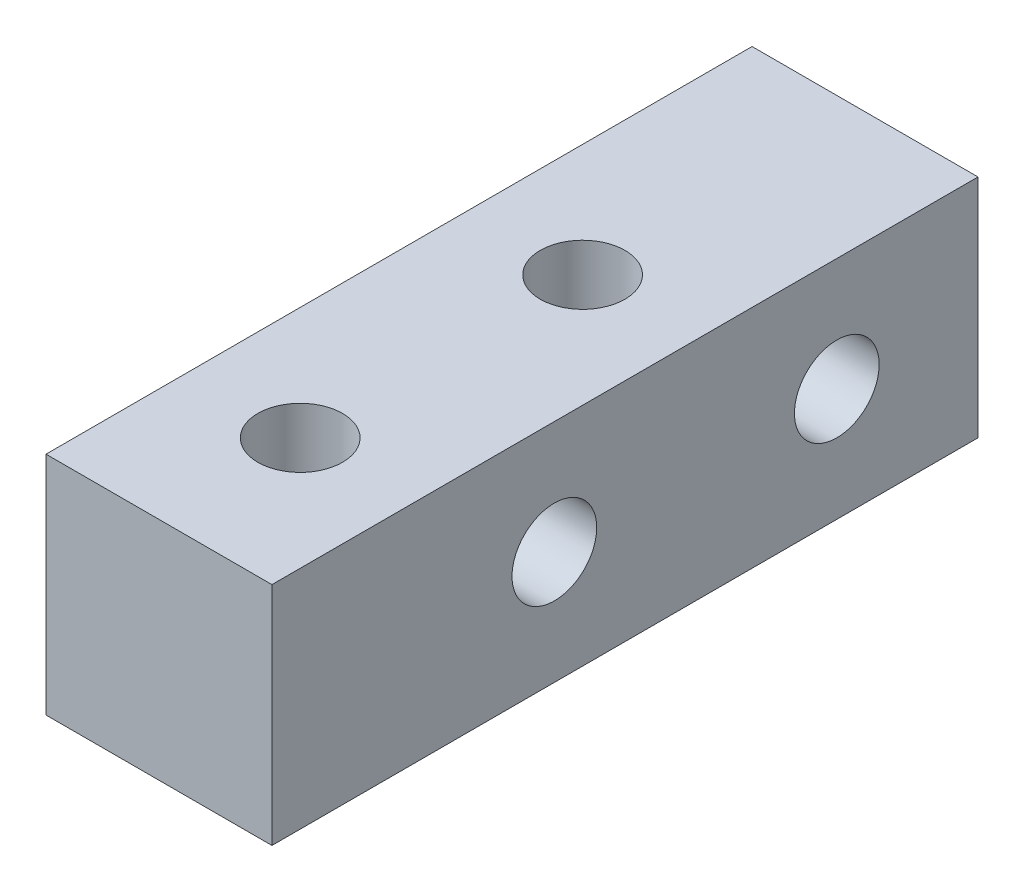
ISO-10303-21;
HEADER;
FILE_DESCRIPTION(('STEP AP214'),'2;1');
FILE_NAME('part.step','',(''),(''),'','','');
FILE_SCHEMA(('AUTOMOTIVE_DESIGN { 1 0 10303 214 1 1 1 1 }'));
ENDSEC;
DATA;
#1=APPLICATION_CONTEXT('core data for automotive mechanical design processes');
#2=APPLICATION_PROTOCOL_DEFINITION('international standard','automotive_design',2000,#1);
#3=PRODUCT_CONTEXT('',#1,'mechanical');
#4=PRODUCT('Part','Part','',(#3));
#5=PRODUCT_RELATED_PRODUCT_CATEGORY('part','',(#4));
#6=PRODUCT_DEFINITION_FORMATION('','',#4);
#7=PRODUCT_DEFINITION_CONTEXT('part definition',#1,'design');
#8=PRODUCT_DEFINITION('design','',#6,#7);
#9=PRODUCT_DEFINITION_SHAPE('','',#8);
#10=(LENGTH_UNIT() NAMED_UNIT(*) SI_UNIT(.MILLI.,.METRE.));
#11=(NAMED_UNIT(*) PLANE_ANGLE_UNIT() SI_UNIT($,.RADIAN.));
#12=(NAMED_UNIT(*) SI_UNIT($,.STERADIAN.) SOLID_ANGLE_UNIT());
#13=UNCERTAINTY_MEASURE_WITH_UNIT(LENGTH_MEASURE(1.E-05),#10,'distance_accuracy_value','');
#14=(GEOMETRIC_REPRESENTATION_CONTEXT(3) GLOBAL_UNCERTAINTY_ASSIGNED_CONTEXT((#13)) GLOBAL_UNIT_ASSIGNED_CONTEXT((#10,
#11,#12)) REPRESENTATION_CONTEXT('',''));
#15=CARTESIAN_POINT('',(0.,0.,0.));
#16=DIRECTION('',(0.,0.,1.));
#17=DIRECTION('',(1.,0.,0.));
#18=AXIS2_PLACEMENT_3D('',#15,#16,#17);
#19=CARTESIAN_POINT('',(4.,-4.,25.));
#20=DIRECTION('',(-1.,0.,0.));
#21=DIRECTION('',(0.,0.,1.));
#22=AXIS2_PLACEMENT_3D('',#19,#20,#21);
#23=PLANE('',#22);
#24=CARTESIAN_POINT('',(4.,0.,5.));
#25=DIRECTION('',(1.,0.,0.));
#26=DIRECTION('',(0.,0.,-1.));
#27=AXIS2_PLACEMENT_3D('',#24,#25,#26);
#28=CIRCLE('',#27,1.5);
#29=CARTESIAN_POINT('',(4.,0.,3.5));
#30=VERTEX_POINT('',#29);
#31=EDGE_CURVE('E125',#30,#30,#28,.T.);
#32=ORIENTED_EDGE('',*,*,#31,.F.);
#33=EDGE_LOOP('',(#32));
#34=FACE_BOUND('',#33,.T.);
#35=CARTESIAN_POINT('',(4.,0.,15.));
#36=DIRECTION('',(1.,0.,0.));
#37=DIRECTION('',(0.,0.,-1.));
#38=AXIS2_PLACEMENT_3D('',#35,#36,#37);
#39=CIRCLE('',#38,1.5);
#40=CARTESIAN_POINT('',(4.,0.,13.5));
#41=VERTEX_POINT('',#40);
#42=EDGE_CURVE('E121',#41,#41,#39,.T.);
#43=ORIENTED_EDGE('',*,*,#42,.F.);
#44=EDGE_LOOP('',(#43));
#45=FACE_BOUND('',#44,.T.);
#46=DIRECTION('',(0.,1.,0.));
#47=VECTOR('',#46,1.);
#48=CARTESIAN_POINT('',(4.,-4.,0.));
#49=LINE('',#48,#47);
#50=CARTESIAN_POINT('',(4.,-4.,0.));
#51=VERTEX_POINT('',#50);
#52=CARTESIAN_POINT('',(4.,4.,0.));
#53=VERTEX_POINT('',#52);
#54=EDGE_CURVE('E104',#51,#53,#49,.T.);
#55=ORIENTED_EDGE('',*,*,#54,.T.);
#56=DIRECTION('',(0.,0.,-1.));
#57=VECTOR('',#56,1.);
#58=CARTESIAN_POINT('',(4.,4.,25.));
#59=LINE('',#58,#57);
#60=CARTESIAN_POINT('',(4.,4.,25.));
#61=VERTEX_POINT('',#60);
#62=EDGE_CURVE('E11',#61,#53,#59,.T.);
#63=ORIENTED_EDGE('',*,*,#62,.F.);
#64=DIRECTION('',(0.,1.,0.));
#65=VECTOR('',#64,1.);
#66=CARTESIAN_POINT('',(4.,-4.,25.));
#67=LINE('',#66,#65);
#68=CARTESIAN_POINT('',(4.,-4.,25.));
#69=VERTEX_POINT('',#68);
#70=EDGE_CURVE('E92',#69,#61,#67,.T.);
#71=ORIENTED_EDGE('',*,*,#70,.F.);
#72=DIRECTION('',(0.,0.,-1.));
#73=VECTOR('',#72,1.);
#74=CARTESIAN_POINT('',(4.,-4.,25.));
#75=LINE('',#74,#73);
#76=EDGE_CURVE('E100',#69,#51,#75,.T.);
#77=ORIENTED_EDGE('',*,*,#76,.T.);
#78=EDGE_LOOP('',(#55,#63,#71,#77));
#79=FACE_BOUND('',#78,.T.);
#80=ADVANCED_FACE('F41',(#34,#45,#79),#23,.F.);
#81=CARTESIAN_POINT('',(-4.,4.,25.));
#82=DIRECTION('',(0.,-1.,0.));
#83=DIRECTION('',(0.,0.,-1.));
#84=AXIS2_PLACEMENT_3D('',#81,#82,#83);
#85=PLANE('',#84);
#86=CARTESIAN_POINT('',(0.,4.,10.));
#87=DIRECTION('',(0.,1.,0.));
#88=DIRECTION('',(0.,0.,1.));
#89=AXIS2_PLACEMENT_3D('',#86,#87,#88);
#90=CIRCLE('',#89,1.5);
#91=CARTESIAN_POINT('',(0.,4.,11.5));
#92=VERTEX_POINT('',#91);
#93=EDGE_CURVE('E136',#92,#92,#90,.T.);
#94=ORIENTED_EDGE('',*,*,#93,.F.);
#95=EDGE_LOOP('',(#94));
#96=FACE_BOUND('',#95,.T.);
#97=CARTESIAN_POINT('',(0.,4.,20.));
#98=DIRECTION('',(0.,1.,0.));
#99=DIRECTION('',(0.,0.,1.));
#100=AXIS2_PLACEMENT_3D('',#97,#98,#99);
#101=CIRCLE('',#100,1.5);
#102=CARTESIAN_POINT('',(0.,4.,21.5));
#103=VERTEX_POINT('',#102);
#104=EDGE_CURVE('E133',#103,#103,#101,.T.);
#105=ORIENTED_EDGE('',*,*,#104,.F.);
#106=EDGE_LOOP('',(#105));
#107=FACE_BOUND('',#106,.T.);
#108=DIRECTION('',(-1.,0.,0.));
#109=VECTOR('',#108,1.);
#110=CARTESIAN_POINT('',(-4.,4.,0.));
#111=LINE('',#110,#109);
#112=CARTESIAN_POINT('',(-4.,4.,0.));
#113=VERTEX_POINT('',#112);
#114=EDGE_CURVE('E96',#53,#113,#111,.T.);
#115=ORIENTED_EDGE('',*,*,#114,.T.);
#116=DIRECTION('',(0.,0.,-1.));
#117=VECTOR('',#116,1.);
#118=CARTESIAN_POINT('',(-4.,4.,25.));
#119=LINE('',#118,#117);
#120=CARTESIAN_POINT('',(-4.,4.,25.));
#121=VERTEX_POINT('',#120);
#122=EDGE_CURVE('E49',#121,#113,#119,.T.);
#123=ORIENTED_EDGE('',*,*,#122,.F.);
#124=DIRECTION('',(-1.,0.,0.));
#125=VECTOR('',#124,1.);
#126=CARTESIAN_POINT('',(-4.,4.,25.));
#127=LINE('',#126,#125);
#128=EDGE_CURVE('E87',#61,#121,#127,.T.);
#129=ORIENTED_EDGE('',*,*,#128,.F.);
#130=ORIENTED_EDGE('',*,*,#62,.T.);
#131=EDGE_LOOP('',(#115,#123,#129,#130));
#132=FACE_BOUND('',#131,.T.);
#133=ADVANCED_FACE('F95',(#96,#107,#132),#85,.F.);
#134=CARTESIAN_POINT('',(-4.,-4.,25.));
#135=DIRECTION('',(1.,0.,0.));
#136=DIRECTION('',(0.,0.,-1.));
#137=AXIS2_PLACEMENT_3D('',#134,#135,#136);
#138=PLANE('',#137);
#139=CARTESIAN_POINT('',(-4.,0.,5.));
#140=DIRECTION('',(1.,0.,0.));
#141=DIRECTION('',(0.,0.,-1.));
#142=AXIS2_PLACEMENT_3D('',#139,#140,#141);
#143=CIRCLE('',#142,1.5);
#144=CARTESIAN_POINT('',(-4.,0.,3.5));
#145=VERTEX_POINT('',#144);
#146=EDGE_CURVE('E107',#145,#145,#143,.T.);
#147=ORIENTED_EDGE('',*,*,#146,.T.);
#148=EDGE_LOOP('',(#147));
#149=FACE_BOUND('',#148,.T.);
#150=CARTESIAN_POINT('',(-4.,0.,15.));
#151=DIRECTION('',(1.,0.,0.));
#152=DIRECTION('',(0.,0.,-1.));
#153=AXIS2_PLACEMENT_3D('',#150,#151,#152);
#154=CIRCLE('',#153,1.5);
#155=CARTESIAN_POINT('',(-4.,0.,13.5));
#156=VERTEX_POINT('',#155);
#157=EDGE_CURVE('E118',#156,#156,#154,.T.);
#158=ORIENTED_EDGE('',*,*,#157,.T.);
#159=EDGE_LOOP('',(#158));
#160=FACE_BOUND('',#159,.T.);
#161=DIRECTION('',(0.,-1.,0.));
#162=VECTOR('',#161,1.);
#163=CARTESIAN_POINT('',(-4.,-4.,0.));
#164=LINE('',#163,#162);
#165=CARTESIAN_POINT('',(-4.,-4.,0.));
#166=VERTEX_POINT('',#165);
#167=EDGE_CURVE('E74',#113,#166,#164,.T.);
#168=ORIENTED_EDGE('',*,*,#167,.T.);
#169=DIRECTION('',(0.,0.,-1.));
#170=VECTOR('',#169,1.);
#171=CARTESIAN_POINT('',(-4.,-4.,25.));
#172=LINE('',#171,#170);
#173=CARTESIAN_POINT('',(-4.,-4.,25.));
#174=VERTEX_POINT('',#173);
#175=EDGE_CURVE('E97',#174,#166,#172,.T.);
#176=ORIENTED_EDGE('',*,*,#175,.F.);
#177=DIRECTION('',(0.,-1.,0.));
#178=VECTOR('',#177,1.);
#179=CARTESIAN_POINT('',(-4.,-4.,25.));
#180=LINE('',#179,#178);
#181=EDGE_CURVE('E90',#121,#174,#180,.T.);
#182=ORIENTED_EDGE('',*,*,#181,.F.);
#183=ORIENTED_EDGE('',*,*,#122,.T.);
#184=EDGE_LOOP('',(#168,#176,#182,#183));
#185=FACE_BOUND('',#184,.T.);
#186=ADVANCED_FACE('F98',(#149,#160,#185),#138,.F.);
#187=CARTESIAN_POINT('',(-4.,-4.,25.));
#188=DIRECTION('',(0.,1.,0.));
#189=DIRECTION('',(0.,0.,1.));
#190=AXIS2_PLACEMENT_3D('',#187,#188,#189);
#191=PLANE('',#190);
#192=CARTESIAN_POINT('',(0.,-4.,10.));
#193=DIRECTION('',(0.,1.,0.));
#194=DIRECTION('',(0.,0.,1.));
#195=AXIS2_PLACEMENT_3D('',#192,#193,#194);
#196=CIRCLE('',#195,1.5);
#197=CARTESIAN_POINT('',(0.,-4.,11.5));
#198=VERTEX_POINT('',#197);
#199=EDGE_CURVE('E122',#198,#198,#196,.T.);
#200=ORIENTED_EDGE('',*,*,#199,.T.);
#201=EDGE_LOOP('',(#200));
#202=FACE_BOUND('',#201,.T.);
#203=CARTESIAN_POINT('',(0.,-4.,20.));
#204=DIRECTION('',(0.,1.,0.));
#205=DIRECTION('',(0.,0.,1.));
#206=AXIS2_PLACEMENT_3D('',#203,#204,#205);
#207=CIRCLE('',#206,1.5);
#208=CARTESIAN_POINT('',(0.,-4.,21.5));
#209=VERTEX_POINT('',#208);
#210=EDGE_CURVE('E130',#209,#209,#207,.T.);
#211=ORIENTED_EDGE('',*,*,#210,.T.);
#212=EDGE_LOOP('',(#211));
#213=FACE_BOUND('',#212,.T.);
#214=DIRECTION('',(1.,0.,0.));
#215=VECTOR('',#214,1.);
#216=CARTESIAN_POINT('',(-4.,-4.,0.));
#217=LINE('',#216,#215);
#218=EDGE_CURVE('E80',#166,#51,#217,.T.);
#219=ORIENTED_EDGE('',*,*,#218,.T.);
#220=ORIENTED_EDGE('',*,*,#76,.F.);
#221=DIRECTION('',(1.,0.,0.));
#222=VECTOR('',#221,1.);
#223=CARTESIAN_POINT('',(-4.,-4.,25.));
#224=LINE('',#223,#222);
#225=EDGE_CURVE('E57',#174,#69,#224,.T.);
#226=ORIENTED_EDGE('',*,*,#225,.F.);
#227=ORIENTED_EDGE('',*,*,#175,.T.);
#228=EDGE_LOOP('',(#219,#220,#226,#227));
#229=FACE_BOUND('',#228,.T.);
#230=ADVANCED_FACE('F112',(#202,#213,#229),#191,.F.);
#231=CARTESIAN_POINT('',(0.,0.,25.));
#232=DIRECTION('',(0.,0.,-1.));
#233=DIRECTION('',(-1.,0.,0.));
#234=AXIS2_PLACEMENT_3D('',#231,#232,#233);
#235=PLANE('',#234);
#236=ORIENTED_EDGE('',*,*,#70,.T.);
#237=ORIENTED_EDGE('',*,*,#128,.T.);
#238=ORIENTED_EDGE('',*,*,#181,.T.);
#239=ORIENTED_EDGE('',*,*,#225,.T.);
#240=EDGE_LOOP('',(#236,#237,#238,#239));
#241=FACE_BOUND('',#240,.T.);
#242=ADVANCED_FACE('F88',(#241),#235,.F.);
#243=CARTESIAN_POINT('',(0.,0.,0.));
#244=DIRECTION('',(0.,0.,-1.));
#245=DIRECTION('',(-1.,0.,0.));
#246=AXIS2_PLACEMENT_3D('',#243,#244,#245);
#247=PLANE('',#246);
#248=ORIENTED_EDGE('',*,*,#54,.F.);
#249=ORIENTED_EDGE('',*,*,#218,.F.);
#250=ORIENTED_EDGE('',*,*,#167,.F.);
#251=ORIENTED_EDGE('',*,*,#114,.F.);
#252=EDGE_LOOP('',(#248,#249,#250,#251));
#253=FACE_BOUND('',#252,.T.);
#254=ADVANCED_FACE('F115',(#253),#247,.T.);
#255=CARTESIAN_POINT('',(-4.,0.,15.));
#256=DIRECTION('',(1.,0.,0.));
#257=DIRECTION('',(0.,0.,-1.));
#258=AXIS2_PLACEMENT_3D('',#255,#256,#257);
#259=CYLINDRICAL_SURFACE('',#258,1.5);
#260=ORIENTED_EDGE('',*,*,#157,.F.);
#261=EDGE_LOOP('',(#260));
#262=FACE_BOUND('',#261,.T.);
#263=ORIENTED_EDGE('',*,*,#42,.T.);
#264=EDGE_LOOP('',(#263));
#265=FACE_BOUND('',#264,.T.);
#266=ADVANCED_FACE('F163',(#262,#265),#259,.F.);
#267=CARTESIAN_POINT('',(-4.,0.,5.));
#268=DIRECTION('',(1.,0.,0.));
#269=DIRECTION('',(0.,0.,-1.));
#270=AXIS2_PLACEMENT_3D('',#267,#268,#269);
#271=CYLINDRICAL_SURFACE('',#270,1.5);
#272=ORIENTED_EDGE('',*,*,#146,.F.);
#273=EDGE_LOOP('',(#272));
#274=FACE_BOUND('',#273,.T.);
#275=ORIENTED_EDGE('',*,*,#31,.T.);
#276=EDGE_LOOP('',(#275));
#277=FACE_BOUND('',#276,.T.);
#278=ADVANCED_FACE('F156',(#274,#277),#271,.F.);
#279=CARTESIAN_POINT('',(0.,-4.,20.));
#280=DIRECTION('',(0.,1.,0.));
#281=DIRECTION('',(0.,0.,1.));
#282=AXIS2_PLACEMENT_3D('',#279,#280,#281);
#283=CYLINDRICAL_SURFACE('',#282,1.5);
#284=ORIENTED_EDGE('',*,*,#210,.F.);
#285=EDGE_LOOP('',(#284));
#286=FACE_BOUND('',#285,.T.);
#287=ORIENTED_EDGE('',*,*,#104,.T.);
#288=EDGE_LOOP('',(#287));
#289=FACE_BOUND('',#288,.T.);
#290=ADVANCED_FACE('F147',(#286,#289),#283,.F.);
#291=CARTESIAN_POINT('',(0.,-4.,10.));
#292=DIRECTION('',(0.,1.,0.));
#293=DIRECTION('',(0.,0.,1.));
#294=AXIS2_PLACEMENT_3D('',#291,#292,#293);
#295=CYLINDRICAL_SURFACE('',#294,1.5);
#296=ORIENTED_EDGE('',*,*,#199,.F.);
#297=EDGE_LOOP('',(#296));
#298=FACE_BOUND('',#297,.T.);
#299=ORIENTED_EDGE('',*,*,#93,.T.);
#300=EDGE_LOOP('',(#299));
#301=FACE_BOUND('',#300,.T.);
#302=ADVANCED_FACE('F144',(#298,#301),#295,.F.);
#303=CLOSED_SHELL('',(#80,#133,#186,#230,#242,#254,#266,#278,#290,#302));
#304=MANIFOLD_SOLID_BREP('B2',#303);
#305=ADVANCED_BREP_SHAPE_REPRESENTATION('',(#18,#304),#14);
#306=SHAPE_DEFINITION_REPRESENTATION(#9,#305);
ENDSEC;
END-ISO-10303-21;
